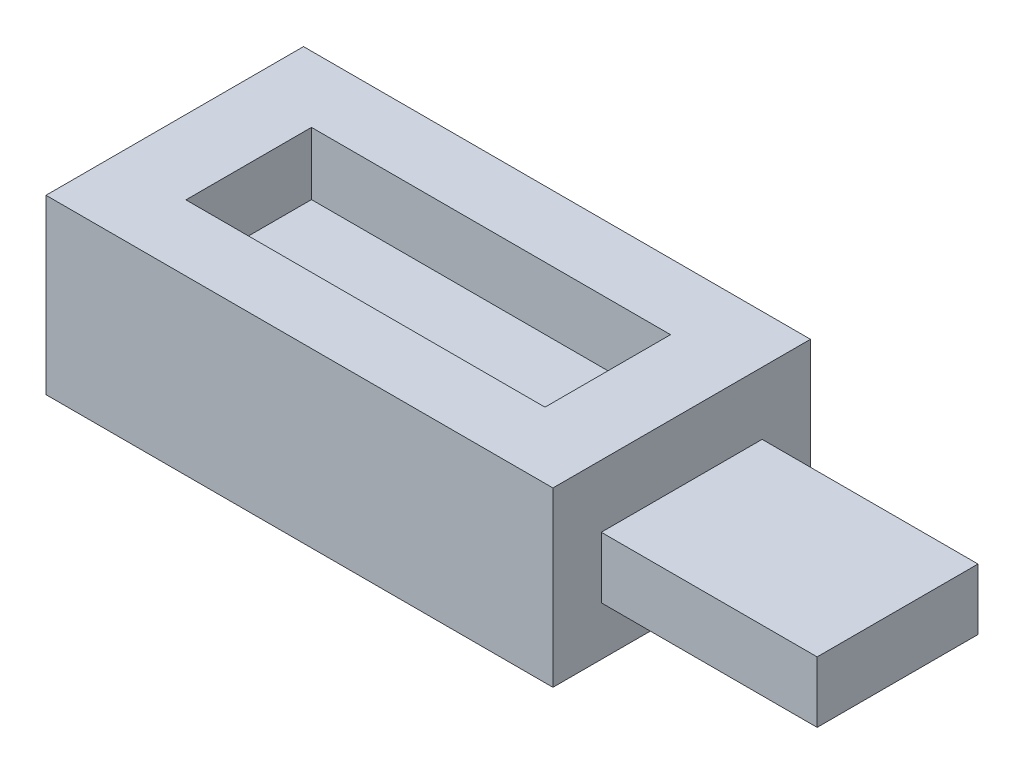
ISO-10303-21;
HEADER;
FILE_DESCRIPTION(('STEP AP214'),'2;1');
FILE_NAME('part.step','',(''),(''),'','','');
FILE_SCHEMA(('AUTOMOTIVE_DESIGN { 1 0 10303 214 1 1 1 1 }'));
ENDSEC;
DATA;
#1=APPLICATION_CONTEXT('core data for automotive mechanical design processes');
#2=APPLICATION_PROTOCOL_DEFINITION('international standard','automotive_design',2000,#1);
#3=PRODUCT_CONTEXT('',#1,'mechanical');
#4=PRODUCT('Part','Part','',(#3));
#5=PRODUCT_RELATED_PRODUCT_CATEGORY('part','',(#4));
#6=PRODUCT_DEFINITION_FORMATION('','',#4);
#7=PRODUCT_DEFINITION_CONTEXT('part definition',#1,'design');
#8=PRODUCT_DEFINITION('design','',#6,#7);
#9=PRODUCT_DEFINITION_SHAPE('','',#8);
#10=(LENGTH_UNIT() NAMED_UNIT(*) SI_UNIT(.MILLI.,.METRE.));
#11=(NAMED_UNIT(*) PLANE_ANGLE_UNIT() SI_UNIT($,.RADIAN.));
#12=(NAMED_UNIT(*) SI_UNIT($,.STERADIAN.) SOLID_ANGLE_UNIT());
#13=UNCERTAINTY_MEASURE_WITH_UNIT(LENGTH_MEASURE(1.E-05),#10,'distance_accuracy_value','');
#14=(GEOMETRIC_REPRESENTATION_CONTEXT(3) GLOBAL_UNCERTAINTY_ASSIGNED_CONTEXT((#13)) GLOBAL_UNIT_ASSIGNED_CONTEXT((#10,
#11,#12)) REPRESENTATION_CONTEXT('',''));
#15=CARTESIAN_POINT('',(0.,0.,0.));
#16=DIRECTION('',(0.,0.,1.));
#17=DIRECTION('',(1.,0.,0.));
#18=AXIS2_PLACEMENT_3D('',#15,#16,#17);
#19=CARTESIAN_POINT('',(102.892841401862,70.104,52.2673742227546));
#20=DIRECTION('',(-1.,0.,0.));
#21=DIRECTION('',(0.,0.,1.));
#22=AXIS2_PLACEMENT_3D('',#19,#20,#21);
#23=PLANE('',#22);
#24=DIRECTION('',(0.,0.,-1.));
#25=VECTOR('',#24,1.);
#26=CARTESIAN_POINT('',(102.892841401862,0.,52.2673742227546));
#27=LINE('',#26,#25);
#28=CARTESIAN_POINT('',(102.892841401862,0.,52.2673742227546));
#29=VERTEX_POINT('',#28);
#30=CARTESIAN_POINT('',(102.892841401862,0.,-52.2673742227546));
#31=VERTEX_POINT('',#30);
#32=EDGE_CURVE('E177',#29,#31,#27,.T.);
#33=ORIENTED_EDGE('',*,*,#32,.T.);
#34=DIRECTION('',(0.,-1.,0.));
#35=VECTOR('',#34,1.);
#36=CARTESIAN_POINT('',(102.892841401862,70.104,-52.2673742227546));
#37=LINE('',#36,#35);
#38=CARTESIAN_POINT('',(102.892841401862,70.104,-52.2673742227546));
#39=VERTEX_POINT('',#38);
#40=EDGE_CURVE('E11',#39,#31,#37,.T.);
#41=ORIENTED_EDGE('',*,*,#40,.F.);
#42=DIRECTION('',(0.,0.,-1.));
#43=VECTOR('',#42,1.);
#44=CARTESIAN_POINT('',(102.892841401862,70.104,52.2673742227546));
#45=LINE('',#44,#43);
#46=CARTESIAN_POINT('',(102.892841401862,70.104,52.2673742227546));
#47=VERTEX_POINT('',#46);
#48=EDGE_CURVE('E184',#47,#39,#45,.T.);
#49=ORIENTED_EDGE('',*,*,#48,.F.);
#50=DIRECTION('',(0.,-1.,0.));
#51=VECTOR('',#50,1.);
#52=CARTESIAN_POINT('',(102.892841401862,70.104,52.2673742227546));
#53=LINE('',#52,#51);
#54=EDGE_CURVE('E194',#47,#29,#53,.T.);
#55=ORIENTED_EDGE('',*,*,#54,.T.);
#56=EDGE_LOOP('',(#33,#41,#49,#55));
#57=FACE_BOUND('',#56,.T.);
#58=DIRECTION('',(0.,1.,0.));
#59=VECTOR('',#58,1.);
#60=CARTESIAN_POINT('',(102.892841401862,19.9219374383319,-32.6490823699169));
#61=LINE('',#60,#59);
#62=CARTESIAN_POINT('',(102.892841401862,19.9219374383319,-32.6490823699169));
#63=VERTEX_POINT('',#62);
#64=CARTESIAN_POINT('',(102.892841401862,44.7215888552026,-32.6490823699169));
#65=VERTEX_POINT('',#64);
#66=EDGE_CURVE('E145',#63,#65,#61,.T.);
#67=ORIENTED_EDGE('',*,*,#66,.F.);
#68=DIRECTION('',(0.,0.,-1.));
#69=VECTOR('',#68,1.);
#70=CARTESIAN_POINT('',(102.892841401862,19.9219374383319,32.6490823699169));
#71=LINE('',#70,#69);
#72=CARTESIAN_POINT('',(102.892841401862,19.9219374383319,32.6490823699169));
#73=VERTEX_POINT('',#72);
#74=EDGE_CURVE('E142',#73,#63,#71,.T.);
#75=ORIENTED_EDGE('',*,*,#74,.F.);
#76=DIRECTION('',(0.,-1.,0.));
#77=VECTOR('',#76,1.);
#78=CARTESIAN_POINT('',(102.892841401862,19.9219374383319,32.6490823699169));
#79=LINE('',#78,#77);
#80=CARTESIAN_POINT('',(102.892841401862,44.7215888552026,32.6490823699169));
#81=VERTEX_POINT('',#80);
#82=EDGE_CURVE('E56',#81,#73,#79,.T.);
#83=ORIENTED_EDGE('',*,*,#82,.F.);
#84=DIRECTION('',(0.,0.,1.));
#85=VECTOR('',#84,1.);
#86=CARTESIAN_POINT('',(102.892841401862,44.7215888552026,32.6490823699169));
#87=LINE('',#86,#85);
#88=EDGE_CURVE('E51',#65,#81,#87,.T.);
#89=ORIENTED_EDGE('',*,*,#88,.F.);
#90=EDGE_LOOP('',(#67,#75,#83,#89));
#91=FACE_BOUND('',#90,.T.);
#92=ADVANCED_FACE('F37',(#57,#91),#23,.F.);
#93=CARTESIAN_POINT('',(-102.892841401862,70.104,-52.2673742227546));
#94=DIRECTION('',(0.,0.,1.));
#95=DIRECTION('',(1.,0.,0.));
#96=AXIS2_PLACEMENT_3D('',#93,#94,#95);
#97=PLANE('',#96);
#98=DIRECTION('',(-1.,0.,0.));
#99=VECTOR('',#98,1.);
#100=CARTESIAN_POINT('',(-102.892841401862,0.,-52.2673742227546));
#101=LINE('',#100,#99);
#102=CARTESIAN_POINT('',(-102.892841401862,0.,-52.2673742227546));
#103=VERTEX_POINT('',#102);
#104=EDGE_CURVE('E197',#31,#103,#101,.T.);
#105=ORIENTED_EDGE('',*,*,#104,.T.);
#106=DIRECTION('',(0.,-1.,0.));
#107=VECTOR('',#106,1.);
#108=CARTESIAN_POINT('',(-102.892841401862,70.104,-52.2673742227546));
#109=LINE('',#108,#107);
#110=CARTESIAN_POINT('',(-102.892841401862,70.104,-52.2673742227546));
#111=VERTEX_POINT('',#110);
#112=EDGE_CURVE('E44',#111,#103,#109,.T.);
#113=ORIENTED_EDGE('',*,*,#112,.F.);
#114=DIRECTION('',(-1.,0.,0.));
#115=VECTOR('',#114,1.);
#116=CARTESIAN_POINT('',(-102.892841401862,70.104,-52.2673742227546));
#117=LINE('',#116,#115);
#118=EDGE_CURVE('E187',#39,#111,#117,.T.);
#119=ORIENTED_EDGE('',*,*,#118,.F.);
#120=ORIENTED_EDGE('',*,*,#40,.T.);
#121=EDGE_LOOP('',(#105,#113,#119,#120));
#122=FACE_BOUND('',#121,.T.);
#123=ADVANCED_FACE('F227',(#122),#97,.F.);
#124=CARTESIAN_POINT('',(-102.892841401862,70.104,52.2673742227546));
#125=DIRECTION('',(1.,0.,0.));
#126=DIRECTION('',(0.,0.,-1.));
#127=AXIS2_PLACEMENT_3D('',#124,#125,#126);
#128=PLANE('',#127);
#129=DIRECTION('',(0.,0.,1.));
#130=VECTOR('',#129,1.);
#131=CARTESIAN_POINT('',(-102.892841401862,0.,52.2673742227546));
#132=LINE('',#131,#130);
#133=CARTESIAN_POINT('',(-102.892841401862,0.,52.2673742227546));
#134=VERTEX_POINT('',#133);
#135=EDGE_CURVE('E199',#103,#134,#132,.T.);
#136=ORIENTED_EDGE('',*,*,#135,.T.);
#137=DIRECTION('',(0.,-1.,0.));
#138=VECTOR('',#137,1.);
#139=CARTESIAN_POINT('',(-102.892841401862,70.104,52.2673742227546));
#140=LINE('',#139,#138);
#141=CARTESIAN_POINT('',(-102.892841401862,70.104,52.2673742227546));
#142=VERTEX_POINT('',#141);
#143=EDGE_CURVE('E204',#142,#134,#140,.T.);
#144=ORIENTED_EDGE('',*,*,#143,.F.);
#145=DIRECTION('',(0.,0.,1.));
#146=VECTOR('',#145,1.);
#147=CARTESIAN_POINT('',(-102.892841401862,70.104,52.2673742227546));
#148=LINE('',#147,#146);
#149=EDGE_CURVE('E190',#111,#142,#148,.T.);
#150=ORIENTED_EDGE('',*,*,#149,.F.);
#151=ORIENTED_EDGE('',*,*,#112,.T.);
#152=EDGE_LOOP('',(#136,#144,#150,#151));
#153=FACE_BOUND('',#152,.T.);
#154=ADVANCED_FACE('F211',(#153),#128,.F.);
#155=CARTESIAN_POINT('',(-102.892841401862,70.104,52.2673742227546));
#156=DIRECTION('',(0.,0.,-1.));
#157=DIRECTION('',(-1.,0.,0.));
#158=AXIS2_PLACEMENT_3D('',#155,#156,#157);
#159=PLANE('',#158);
#160=DIRECTION('',(1.,0.,0.));
#161=VECTOR('',#160,1.);
#162=CARTESIAN_POINT('',(-102.892841401862,0.,52.2673742227546));
#163=LINE('',#162,#161);
#164=EDGE_CURVE('E188',#134,#29,#163,.T.);
#165=ORIENTED_EDGE('',*,*,#164,.T.);
#166=ORIENTED_EDGE('',*,*,#54,.F.);
#167=DIRECTION('',(1.,0.,0.));
#168=VECTOR('',#167,1.);
#169=CARTESIAN_POINT('',(-102.892841401862,70.104,52.2673742227546));
#170=LINE('',#169,#168);
#171=EDGE_CURVE('E192',#142,#47,#170,.T.);
#172=ORIENTED_EDGE('',*,*,#171,.F.);
#173=ORIENTED_EDGE('',*,*,#143,.T.);
#174=EDGE_LOOP('',(#165,#166,#172,#173));
#175=FACE_BOUND('',#174,.T.);
#176=ADVANCED_FACE('F220',(#175),#159,.F.);
#177=CARTESIAN_POINT('',(0.,70.104,0.));
#178=DIRECTION('',(0.,-1.,0.));
#179=DIRECTION('',(0.,0.,-1.));
#180=AXIS2_PLACEMENT_3D('',#177,#178,#179);
#181=PLANE('',#180);
#182=DIRECTION('',(-1.,0.,0.));
#183=VECTOR('',#182,1.);
#184=CARTESIAN_POINT('',(-72.8794328331901,70.104,-25.4870488631695));
#185=LINE('',#184,#183);
#186=CARTESIAN_POINT('',(72.8794328331901,70.104,-25.4870488631695));
#187=VERTEX_POINT('',#186);
#188=CARTESIAN_POINT('',(-72.8794328331901,70.104,-25.4870488631695));
#189=VERTEX_POINT('',#188);
#190=EDGE_CURVE('E148',#187,#189,#185,.T.);
#191=ORIENTED_EDGE('',*,*,#190,.F.);
#192=DIRECTION('',(0.,0.,-1.));
#193=VECTOR('',#192,1.);
#194=CARTESIAN_POINT('',(72.8794328331901,70.104,25.4870488631695));
#195=LINE('',#194,#193);
#196=CARTESIAN_POINT('',(72.8794328331901,70.104,25.4870488631695));
#197=VERTEX_POINT('',#196);
#198=EDGE_CURVE('E146',#197,#187,#195,.T.);
#199=ORIENTED_EDGE('',*,*,#198,.F.);
#200=DIRECTION('',(1.,0.,0.));
#201=VECTOR('',#200,1.);
#202=CARTESIAN_POINT('',(-72.8794328331901,70.104,25.4870488631695));
#203=LINE('',#202,#201);
#204=CARTESIAN_POINT('',(-72.8794328331901,70.104,25.4870488631695));
#205=VERTEX_POINT('',#204);
#206=EDGE_CURVE('E158',#205,#197,#203,.T.);
#207=ORIENTED_EDGE('',*,*,#206,.F.);
#208=DIRECTION('',(0.,0.,1.));
#209=VECTOR('',#208,1.);
#210=CARTESIAN_POINT('',(-72.8794328331901,70.104,25.4870488631695));
#211=LINE('',#210,#209);
#212=EDGE_CURVE('E170',#189,#205,#211,.T.);
#213=ORIENTED_EDGE('',*,*,#212,.F.);
#214=EDGE_LOOP('',(#191,#199,#207,#213));
#215=FACE_BOUND('',#214,.T.);
#216=ORIENTED_EDGE('',*,*,#48,.T.);
#217=ORIENTED_EDGE('',*,*,#118,.T.);
#218=ORIENTED_EDGE('',*,*,#149,.T.);
#219=ORIENTED_EDGE('',*,*,#171,.T.);
#220=EDGE_LOOP('',(#216,#217,#218,#219));
#221=FACE_BOUND('',#220,.T.);
#222=ADVANCED_FACE('F226',(#215,#221),#181,.F.);
#223=CARTESIAN_POINT('',(0.,0.,0.));
#224=DIRECTION('',(0.,-1.,0.));
#225=DIRECTION('',(0.,0.,-1.));
#226=AXIS2_PLACEMENT_3D('',#223,#224,#225);
#227=PLANE('',#226);
#228=ORIENTED_EDGE('',*,*,#32,.F.);
#229=ORIENTED_EDGE('',*,*,#164,.F.);
#230=ORIENTED_EDGE('',*,*,#135,.F.);
#231=ORIENTED_EDGE('',*,*,#104,.F.);
#232=EDGE_LOOP('',(#228,#229,#230,#231));
#233=FACE_BOUND('',#232,.T.);
#234=ADVANCED_FACE('F217',(#233),#227,.T.);
#235=CARTESIAN_POINT('',(72.8794328331901,44.704,25.4870488631695));
#236=DIRECTION('',(1.,0.,0.));
#237=DIRECTION('',(0.,0.,-1.));
#238=AXIS2_PLACEMENT_3D('',#235,#236,#237);
#239=PLANE('',#238);
#240=ORIENTED_EDGE('',*,*,#198,.T.);
#241=DIRECTION('',(0.,1.,0.));
#242=VECTOR('',#241,1.);
#243=CARTESIAN_POINT('',(72.8794328331901,44.704,-25.4870488631695));
#244=LINE('',#243,#242);
#245=CARTESIAN_POINT('',(72.8794328331901,44.704,-25.4870488631695));
#246=VERTEX_POINT('',#245);
#247=EDGE_CURVE('E166',#246,#187,#244,.T.);
#248=ORIENTED_EDGE('',*,*,#247,.F.);
#249=DIRECTION('',(0.,0.,-1.));
#250=VECTOR('',#249,1.);
#251=CARTESIAN_POINT('',(72.8794328331901,44.704,25.4870488631695));
#252=LINE('',#251,#250);
#253=CARTESIAN_POINT('',(72.8794328331901,44.704,25.4870488631695));
#254=VERTEX_POINT('',#253);
#255=EDGE_CURVE('E154',#254,#246,#252,.T.);
#256=ORIENTED_EDGE('',*,*,#255,.F.);
#257=DIRECTION('',(0.,1.,0.));
#258=VECTOR('',#257,1.);
#259=CARTESIAN_POINT('',(72.8794328331901,44.704,25.4870488631695));
#260=LINE('',#259,#258);
#261=EDGE_CURVE('E175',#254,#197,#260,.T.);
#262=ORIENTED_EDGE('',*,*,#261,.T.);
#263=EDGE_LOOP('',(#240,#248,#256,#262));
#264=FACE_BOUND('',#263,.T.);
#265=ADVANCED_FACE('F239',(#264),#239,.F.);
#266=CARTESIAN_POINT('',(-72.8794328331901,44.704,25.4870488631695));
#267=DIRECTION('',(0.,0.,1.));
#268=DIRECTION('',(1.,0.,0.));
#269=AXIS2_PLACEMENT_3D('',#266,#267,#268);
#270=PLANE('',#269);
#271=ORIENTED_EDGE('',*,*,#206,.T.);
#272=ORIENTED_EDGE('',*,*,#261,.F.);
#273=DIRECTION('',(1.,0.,0.));
#274=VECTOR('',#273,1.);
#275=CARTESIAN_POINT('',(-72.8794328331901,44.704,25.4870488631695));
#276=LINE('',#275,#274);
#277=CARTESIAN_POINT('',(-72.8794328331901,44.704,25.4870488631695));
#278=VERTEX_POINT('',#277);
#279=EDGE_CURVE('E164',#278,#254,#276,.T.);
#280=ORIENTED_EDGE('',*,*,#279,.F.);
#281=DIRECTION('',(0.,1.,0.));
#282=VECTOR('',#281,1.);
#283=CARTESIAN_POINT('',(-72.8794328331901,44.704,25.4870488631695));
#284=LINE('',#283,#282);
#285=EDGE_CURVE('E178',#278,#205,#284,.T.);
#286=ORIENTED_EDGE('',*,*,#285,.T.);
#287=EDGE_LOOP('',(#271,#272,#280,#286));
#288=FACE_BOUND('',#287,.T.);
#289=ADVANCED_FACE('F245',(#288),#270,.F.);
#290=CARTESIAN_POINT('',(-72.8794328331901,44.704,25.4870488631695));
#291=DIRECTION('',(-1.,0.,0.));
#292=DIRECTION('',(0.,0.,1.));
#293=AXIS2_PLACEMENT_3D('',#290,#291,#292);
#294=PLANE('',#293);
#295=ORIENTED_EDGE('',*,*,#212,.T.);
#296=ORIENTED_EDGE('',*,*,#285,.F.);
#297=DIRECTION('',(0.,0.,1.));
#298=VECTOR('',#297,1.);
#299=CARTESIAN_POINT('',(-72.8794328331901,44.704,25.4870488631695));
#300=LINE('',#299,#298);
#301=CARTESIAN_POINT('',(-72.8794328331901,44.704,-25.4870488631695));
#302=VERTEX_POINT('',#301);
#303=EDGE_CURVE('E161',#302,#278,#300,.T.);
#304=ORIENTED_EDGE('',*,*,#303,.F.);
#305=DIRECTION('',(0.,1.,0.));
#306=VECTOR('',#305,1.);
#307=CARTESIAN_POINT('',(-72.8794328331901,44.704,-25.4870488631695));
#308=LINE('',#307,#306);
#309=EDGE_CURVE('E180',#302,#189,#308,.T.);
#310=ORIENTED_EDGE('',*,*,#309,.T.);
#311=EDGE_LOOP('',(#295,#296,#304,#310));
#312=FACE_BOUND('',#311,.T.);
#313=ADVANCED_FACE('F251',(#312),#294,.F.);
#314=CARTESIAN_POINT('',(-72.8794328331901,44.704,-25.4870488631695));
#315=DIRECTION('',(0.,0.,-1.));
#316=DIRECTION('',(-1.,0.,0.));
#317=AXIS2_PLACEMENT_3D('',#314,#315,#316);
#318=PLANE('',#317);
#319=ORIENTED_EDGE('',*,*,#190,.T.);
#320=ORIENTED_EDGE('',*,*,#309,.F.);
#321=DIRECTION('',(-1.,0.,0.));
#322=VECTOR('',#321,1.);
#323=CARTESIAN_POINT('',(-72.8794328331901,44.704,-25.4870488631695));
#324=LINE('',#323,#322);
#325=EDGE_CURVE('E157',#246,#302,#324,.T.);
#326=ORIENTED_EDGE('',*,*,#325,.F.);
#327=ORIENTED_EDGE('',*,*,#247,.T.);
#328=EDGE_LOOP('',(#319,#320,#326,#327));
#329=FACE_BOUND('',#328,.T.);
#330=ADVANCED_FACE('F247',(#329),#318,.F.);
#331=CARTESIAN_POINT('',(0.,44.704,0.));
#332=DIRECTION('',(0.,-1.,0.));
#333=DIRECTION('',(0.,0.,-1.));
#334=AXIS2_PLACEMENT_3D('',#331,#332,#333);
#335=PLANE('',#334);
#336=ORIENTED_EDGE('',*,*,#255,.T.);
#337=ORIENTED_EDGE('',*,*,#325,.T.);
#338=ORIENTED_EDGE('',*,*,#303,.T.);
#339=ORIENTED_EDGE('',*,*,#279,.T.);
#340=EDGE_LOOP('',(#336,#337,#338,#339));
#341=FACE_BOUND('',#340,.T.);
#342=ADVANCED_FACE('F250',(#341),#335,.F.);
#343=CARTESIAN_POINT('',(190.522841401863,19.9219374383319,-32.6490823699169));
#344=DIRECTION('',(0.,0.,1.));
#345=DIRECTION('',(1.,0.,0.));
#346=AXIS2_PLACEMENT_3D('',#343,#344,#345);
#347=PLANE('',#346);
#348=ORIENTED_EDGE('',*,*,#66,.T.);
#349=DIRECTION('',(-1.,0.,0.));
#350=VECTOR('',#349,1.);
#351=CARTESIAN_POINT('',(190.522841401863,44.7215888552026,-32.6490823699169));
#352=LINE('',#351,#350);
#353=CARTESIAN_POINT('',(190.522841401863,44.7215888552026,-32.6490823699169));
#354=VERTEX_POINT('',#353);
#355=EDGE_CURVE('E126',#354,#65,#352,.T.);
#356=ORIENTED_EDGE('',*,*,#355,.F.);
#357=DIRECTION('',(0.,1.,0.));
#358=VECTOR('',#357,1.);
#359=CARTESIAN_POINT('',(190.522841401863,19.9219374383319,-32.6490823699169));
#360=LINE('',#359,#358);
#361=CARTESIAN_POINT('',(190.522841401863,19.9219374383319,-32.6490823699169));
#362=VERTEX_POINT('',#361);
#363=EDGE_CURVE('E133',#362,#354,#360,.T.);
#364=ORIENTED_EDGE('',*,*,#363,.F.);
#365=DIRECTION('',(-1.,0.,0.));
#366=VECTOR('',#365,1.);
#367=CARTESIAN_POINT('',(190.522841401863,19.9219374383319,-32.6490823699169));
#368=LINE('',#367,#366);
#369=EDGE_CURVE('E381',#362,#63,#368,.T.);
#370=ORIENTED_EDGE('',*,*,#369,.T.);
#371=EDGE_LOOP('',(#348,#356,#364,#370));
#372=FACE_BOUND('',#371,.T.);
#373=ADVANCED_FACE('F144',(#372),#347,.F.);
#374=CARTESIAN_POINT('',(190.522841401863,44.7215888552026,32.6490823699169));
#375=DIRECTION('',(0.,-1.,0.));
#376=DIRECTION('',(0.,0.,-1.));
#377=AXIS2_PLACEMENT_3D('',#374,#375,#376);
#378=PLANE('',#377);
#379=ORIENTED_EDGE('',*,*,#88,.T.);
#380=DIRECTION('',(-1.,0.,0.));
#381=VECTOR('',#380,1.);
#382=CARTESIAN_POINT('',(190.522841401863,44.7215888552026,32.6490823699169));
#383=LINE('',#382,#381);
#384=CARTESIAN_POINT('',(190.522841401863,44.7215888552026,32.6490823699169));
#385=VERTEX_POINT('',#384);
#386=EDGE_CURVE('E129',#385,#81,#383,.T.);
#387=ORIENTED_EDGE('',*,*,#386,.F.);
#388=DIRECTION('',(0.,0.,1.));
#389=VECTOR('',#388,1.);
#390=CARTESIAN_POINT('',(190.522841401863,44.7215888552026,32.6490823699169));
#391=LINE('',#390,#389);
#392=EDGE_CURVE('E122',#354,#385,#391,.T.);
#393=ORIENTED_EDGE('',*,*,#392,.F.);
#394=ORIENTED_EDGE('',*,*,#355,.T.);
#395=EDGE_LOOP('',(#379,#387,#393,#394));
#396=FACE_BOUND('',#395,.T.);
#397=ADVANCED_FACE('F124',(#396),#378,.F.);
#398=CARTESIAN_POINT('',(190.522841401863,19.9219374383319,32.6490823699169));
#399=DIRECTION('',(0.,0.,-1.));
#400=DIRECTION('',(-1.,0.,0.));
#401=AXIS2_PLACEMENT_3D('',#398,#399,#400);
#402=PLANE('',#401);
#403=ORIENTED_EDGE('',*,*,#82,.T.);
#404=DIRECTION('',(-1.,0.,0.));
#405=VECTOR('',#404,1.);
#406=CARTESIAN_POINT('',(190.522841401863,19.9219374383319,32.6490823699169));
#407=LINE('',#406,#405);
#408=CARTESIAN_POINT('',(190.522841401863,19.9219374383319,32.6490823699169));
#409=VERTEX_POINT('',#408);
#410=EDGE_CURVE('E150',#409,#73,#407,.T.);
#411=ORIENTED_EDGE('',*,*,#410,.F.);
#412=DIRECTION('',(0.,-1.,0.));
#413=VECTOR('',#412,1.);
#414=CARTESIAN_POINT('',(190.522841401863,19.9219374383319,32.6490823699169));
#415=LINE('',#414,#413);
#416=EDGE_CURVE('E132',#385,#409,#415,.T.);
#417=ORIENTED_EDGE('',*,*,#416,.F.);
#418=ORIENTED_EDGE('',*,*,#386,.T.);
#419=EDGE_LOOP('',(#403,#411,#417,#418));
#420=FACE_BOUND('',#419,.T.);
#421=ADVANCED_FACE('F266',(#420),#402,.F.);
#422=CARTESIAN_POINT('',(190.522841401863,19.9219374383319,32.6490823699169));
#423=DIRECTION('',(0.,1.,0.));
#424=DIRECTION('',(0.,0.,1.));
#425=AXIS2_PLACEMENT_3D('',#422,#423,#424);
#426=PLANE('',#425);
#427=ORIENTED_EDGE('',*,*,#74,.T.);
#428=ORIENTED_EDGE('',*,*,#369,.F.);
#429=DIRECTION('',(0.,0.,-1.));
#430=VECTOR('',#429,1.);
#431=CARTESIAN_POINT('',(190.522841401863,19.9219374383319,32.6490823699169));
#432=LINE('',#431,#430);
#433=EDGE_CURVE('E138',#409,#362,#432,.T.);
#434=ORIENTED_EDGE('',*,*,#433,.F.);
#435=ORIENTED_EDGE('',*,*,#410,.T.);
#436=EDGE_LOOP('',(#427,#428,#434,#435));
#437=FACE_BOUND('',#436,.T.);
#438=ADVANCED_FACE('F269',(#437),#426,.F.);
#439=CARTESIAN_POINT('',(190.522841401863,0.,0.));
#440=DIRECTION('',(-1.,0.,0.));
#441=DIRECTION('',(0.,0.,1.));
#442=AXIS2_PLACEMENT_3D('',#439,#440,#441);
#443=PLANE('',#442);
#444=ORIENTED_EDGE('',*,*,#363,.T.);
#445=ORIENTED_EDGE('',*,*,#392,.T.);
#446=ORIENTED_EDGE('',*,*,#416,.T.);
#447=ORIENTED_EDGE('',*,*,#433,.T.);
#448=EDGE_LOOP('',(#444,#445,#446,#447));
#449=FACE_BOUND('',#448,.T.);
#450=ADVANCED_FACE('F136',(#449),#443,.F.);
#451=CLOSED_SHELL('',(#92,#123,#154,#176,#222,#234,#265,#289,#313,#330,#342,#373,#397,#421,#438,#450));
#452=MANIFOLD_SOLID_BREP('B2',#451);
#453=ADVANCED_BREP_SHAPE_REPRESENTATION('',(#18,#452),#14);
#454=SHAPE_DEFINITION_REPRESENTATION(#9,#453);
ENDSEC;
END-ISO-10303-21;
